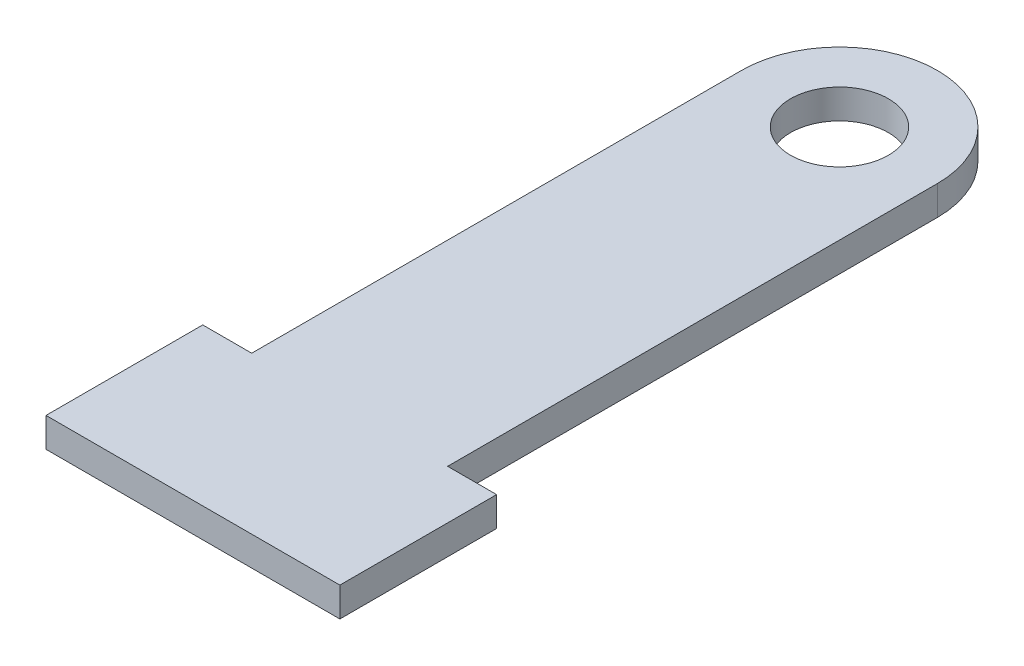
ISO-10303-21;
HEADER;
FILE_DESCRIPTION(('STEP AP214'),'2;1');
FILE_NAME('part.step','',(''),(''),'','','');
FILE_SCHEMA(('AUTOMOTIVE_DESIGN { 1 0 10303 214 1 1 1 1 }'));
ENDSEC;
DATA;
#1=APPLICATION_CONTEXT('core data for automotive mechanical design processes');
#2=APPLICATION_PROTOCOL_DEFINITION('international standard','automotive_design',2000,#1);
#3=PRODUCT_CONTEXT('',#1,'mechanical');
#4=PRODUCT('Part','Part','',(#3));
#5=PRODUCT_RELATED_PRODUCT_CATEGORY('part','',(#4));
#6=PRODUCT_DEFINITION_FORMATION('','',#4);
#7=PRODUCT_DEFINITION_CONTEXT('part definition',#1,'design');
#8=PRODUCT_DEFINITION('design','',#6,#7);
#9=PRODUCT_DEFINITION_SHAPE('','',#8);
#10=(LENGTH_UNIT() NAMED_UNIT(*) SI_UNIT(.MILLI.,.METRE.));
#11=(NAMED_UNIT(*) PLANE_ANGLE_UNIT() SI_UNIT($,.RADIAN.));
#12=(NAMED_UNIT(*) SI_UNIT($,.STERADIAN.) SOLID_ANGLE_UNIT());
#13=UNCERTAINTY_MEASURE_WITH_UNIT(LENGTH_MEASURE(1.E-05),#10,'distance_accuracy_value','');
#14=(GEOMETRIC_REPRESENTATION_CONTEXT(3) GLOBAL_UNCERTAINTY_ASSIGNED_CONTEXT((#13)) GLOBAL_UNIT_ASSIGNED_CONTEXT((#10,
#11,#12)) REPRESENTATION_CONTEXT('',''));
#15=CARTESIAN_POINT('',(0.,0.,0.));
#16=DIRECTION('',(0.,0.,1.));
#17=DIRECTION('',(1.,0.,0.));
#18=AXIS2_PLACEMENT_3D('',#15,#16,#17);
#19=CARTESIAN_POINT('',(-1.5,-0.3,0.));
#20=DIRECTION('',(0.,0.,-1.));
#21=DIRECTION('',(-1.,0.,0.));
#22=AXIS2_PLACEMENT_3D('',#19,#20,#21);
#23=PLANE('',#22);
#24=DIRECTION('',(-1.,0.,0.));
#25=VECTOR('',#24,1.);
#26=CARTESIAN_POINT('',(-1.5,0.,0.));
#27=LINE('',#26,#25);
#28=CARTESIAN_POINT('',(-1.,0.,0.));
#29=VERTEX_POINT('',#28);
#30=CARTESIAN_POINT('',(-1.5,0.,0.));
#31=VERTEX_POINT('',#30);
#32=EDGE_CURVE('E135',#29,#31,#27,.T.);
#33=ORIENTED_EDGE('',*,*,#32,.F.);
#34=DIRECTION('',(0.,1.,0.));
#35=VECTOR('',#34,1.);
#36=CARTESIAN_POINT('',(-1.,-0.3,0.));
#37=LINE('',#36,#35);
#38=CARTESIAN_POINT('',(-1.,-0.3,0.));
#39=VERTEX_POINT('',#38);
#40=EDGE_CURVE('E11',#39,#29,#37,.T.);
#41=ORIENTED_EDGE('',*,*,#40,.F.);
#42=DIRECTION('',(-1.,0.,0.));
#43=VECTOR('',#42,1.);
#44=CARTESIAN_POINT('',(-1.5,-0.3,0.));
#45=LINE('',#44,#43);
#46=CARTESIAN_POINT('',(-1.5,-0.3,0.));
#47=VERTEX_POINT('',#46);
#48=EDGE_CURVE('E156',#39,#47,#45,.T.);
#49=ORIENTED_EDGE('',*,*,#48,.T.);
#50=DIRECTION('',(0.,1.,0.));
#51=VECTOR('',#50,1.);
#52=CARTESIAN_POINT('',(-1.5,-0.3,0.));
#53=LINE('',#52,#51);
#54=EDGE_CURVE('E41',#47,#31,#53,.T.);
#55=ORIENTED_EDGE('',*,*,#54,.T.);
#56=EDGE_LOOP('',(#33,#41,#49,#55));
#57=FACE_BOUND('',#56,.T.);
#58=ADVANCED_FACE('F38',(#57),#23,.T.);
#59=CARTESIAN_POINT('',(-1.,-0.3,0.));
#60=DIRECTION('',(-1.,0.,0.));
#61=DIRECTION('',(0.,0.,1.));
#62=AXIS2_PLACEMENT_3D('',#59,#60,#61);
#63=PLANE('',#62);
#64=DIRECTION('',(0.,0.,1.));
#65=VECTOR('',#64,1.);
#66=CARTESIAN_POINT('',(-1.,0.,0.));
#67=LINE('',#66,#65);
#68=CARTESIAN_POINT('',(-1.,0.,-5.));
#69=VERTEX_POINT('',#68);
#70=EDGE_CURVE('E154',#69,#29,#67,.T.);
#71=ORIENTED_EDGE('',*,*,#70,.F.);
#72=DIRECTION('',(0.,1.,0.));
#73=VECTOR('',#72,1.);
#74=CARTESIAN_POINT('',(-1.,-0.3,-5.));
#75=LINE('',#74,#73);
#76=CARTESIAN_POINT('',(-1.,-0.3,-5.));
#77=VERTEX_POINT('',#76);
#78=EDGE_CURVE('E47',#77,#69,#75,.T.);
#79=ORIENTED_EDGE('',*,*,#78,.F.);
#80=DIRECTION('',(0.,0.,1.));
#81=VECTOR('',#80,1.);
#82=CARTESIAN_POINT('',(-1.,-0.3,0.));
#83=LINE('',#82,#81);
#84=EDGE_CURVE('E125',#77,#39,#83,.T.);
#85=ORIENTED_EDGE('',*,*,#84,.T.);
#86=ORIENTED_EDGE('',*,*,#40,.T.);
#87=EDGE_LOOP('',(#71,#79,#85,#86));
#88=FACE_BOUND('',#87,.T.);
#89=ADVANCED_FACE('F168',(#88),#63,.T.);
#90=CARTESIAN_POINT('',(0.,-0.3,-5.));
#91=DIRECTION('',(0.,1.,0.));
#92=DIRECTION('',(0.,0.,1.));
#93=AXIS2_PLACEMENT_3D('',#90,#91,#92);
#94=CYLINDRICAL_SURFACE('',#93,1.);
#95=CARTESIAN_POINT('',(0.,0.,-5.));
#96=DIRECTION('',(0.,1.,0.));
#97=DIRECTION('',(0.,0.,1.));
#98=AXIS2_PLACEMENT_3D('',#95,#96,#97);
#99=CIRCLE('',#98,1.);
#100=CARTESIAN_POINT('',(1.,0.,-5.));
#101=VERTEX_POINT('',#100);
#102=EDGE_CURVE('E112',#101,#69,#99,.T.);
#103=ORIENTED_EDGE('',*,*,#102,.F.);
#104=DIRECTION('',(0.,1.,0.));
#105=VECTOR('',#104,1.);
#106=CARTESIAN_POINT('',(1.,-0.3,-5.));
#107=LINE('',#106,#105);
#108=CARTESIAN_POINT('',(1.,-0.3,-5.));
#109=VERTEX_POINT('',#108);
#110=EDGE_CURVE('E107',#109,#101,#107,.T.);
#111=ORIENTED_EDGE('',*,*,#110,.F.);
#112=CARTESIAN_POINT('',(0.,-0.3,-5.));
#113=DIRECTION('',(0.,1.,0.));
#114=DIRECTION('',(0.,0.,1.));
#115=AXIS2_PLACEMENT_3D('',#112,#113,#114);
#116=CIRCLE('',#115,1.);
#117=EDGE_CURVE('E110',#109,#77,#116,.T.);
#118=ORIENTED_EDGE('',*,*,#117,.T.);
#119=ORIENTED_EDGE('',*,*,#78,.T.);
#120=EDGE_LOOP('',(#103,#111,#118,#119));
#121=FACE_BOUND('',#120,.T.);
#122=ADVANCED_FACE('F109',(#121),#94,.T.);
#123=CARTESIAN_POINT('',(1.,-0.3,0.));
#124=DIRECTION('',(1.,0.,0.));
#125=DIRECTION('',(0.,0.,-1.));
#126=AXIS2_PLACEMENT_3D('',#123,#124,#125);
#127=PLANE('',#126);
#128=DIRECTION('',(0.,0.,-1.));
#129=VECTOR('',#128,1.);
#130=CARTESIAN_POINT('',(1.,0.,0.));
#131=LINE('',#130,#129);
#132=CARTESIAN_POINT('',(1.,0.,0.));
#133=VERTEX_POINT('',#132);
#134=EDGE_CURVE('E151',#133,#101,#131,.T.);
#135=ORIENTED_EDGE('',*,*,#134,.F.);
#136=DIRECTION('',(0.,1.,0.));
#137=VECTOR('',#136,1.);
#138=CARTESIAN_POINT('',(1.,-0.3,0.));
#139=LINE('',#138,#137);
#140=CARTESIAN_POINT('',(1.,-0.3,0.));
#141=VERTEX_POINT('',#140);
#142=EDGE_CURVE('E117',#141,#133,#139,.T.);
#143=ORIENTED_EDGE('',*,*,#142,.F.);
#144=DIRECTION('',(0.,0.,-1.));
#145=VECTOR('',#144,1.);
#146=CARTESIAN_POINT('',(1.,-0.3,0.));
#147=LINE('',#146,#145);
#148=EDGE_CURVE('E123',#141,#109,#147,.T.);
#149=ORIENTED_EDGE('',*,*,#148,.T.);
#150=ORIENTED_EDGE('',*,*,#110,.T.);
#151=EDGE_LOOP('',(#135,#143,#149,#150));
#152=FACE_BOUND('',#151,.T.);
#153=ADVANCED_FACE('F127',(#152),#127,.T.);
#154=CARTESIAN_POINT('',(1.,-0.3,0.));
#155=DIRECTION('',(0.,0.,-1.));
#156=DIRECTION('',(-1.,0.,0.));
#157=AXIS2_PLACEMENT_3D('',#154,#155,#156);
#158=PLANE('',#157);
#159=DIRECTION('',(-1.,0.,0.));
#160=VECTOR('',#159,1.);
#161=CARTESIAN_POINT('',(1.,0.,0.));
#162=LINE('',#161,#160);
#163=CARTESIAN_POINT('',(1.5,0.,0.));
#164=VERTEX_POINT('',#163);
#165=EDGE_CURVE('E148',#164,#133,#162,.T.);
#166=ORIENTED_EDGE('',*,*,#165,.F.);
#167=DIRECTION('',(0.,1.,0.));
#168=VECTOR('',#167,1.);
#169=CARTESIAN_POINT('',(1.5,-0.3,0.));
#170=LINE('',#169,#168);
#171=CARTESIAN_POINT('',(1.5,-0.3,0.));
#172=VERTEX_POINT('',#171);
#173=EDGE_CURVE('E160',#172,#164,#170,.T.);
#174=ORIENTED_EDGE('',*,*,#173,.F.);
#175=DIRECTION('',(-1.,0.,0.));
#176=VECTOR('',#175,1.);
#177=CARTESIAN_POINT('',(1.,-0.3,0.));
#178=LINE('',#177,#176);
#179=EDGE_CURVE('E128',#172,#141,#178,.T.);
#180=ORIENTED_EDGE('',*,*,#179,.T.);
#181=ORIENTED_EDGE('',*,*,#142,.T.);
#182=EDGE_LOOP('',(#166,#174,#180,#181));
#183=FACE_BOUND('',#182,.T.);
#184=ADVANCED_FACE('F181',(#183),#158,.T.);
#185=CARTESIAN_POINT('',(1.5,-0.3,0.));
#186=DIRECTION('',(1.,0.,0.));
#187=DIRECTION('',(0.,0.,-1.));
#188=AXIS2_PLACEMENT_3D('',#185,#186,#187);
#189=PLANE('',#188);
#190=DIRECTION('',(0.,0.,-1.));
#191=VECTOR('',#190,1.);
#192=CARTESIAN_POINT('',(1.5,0.,0.));
#193=LINE('',#192,#191);
#194=CARTESIAN_POINT('',(1.5,0.,1.6));
#195=VERTEX_POINT('',#194);
#196=EDGE_CURVE('E145',#195,#164,#193,.T.);
#197=ORIENTED_EDGE('',*,*,#196,.F.);
#198=DIRECTION('',(0.,1.,0.));
#199=VECTOR('',#198,1.);
#200=CARTESIAN_POINT('',(1.5,-0.3,1.6));
#201=LINE('',#200,#199);
#202=CARTESIAN_POINT('',(1.5,-0.3,1.6));
#203=VERTEX_POINT('',#202);
#204=EDGE_CURVE('E162',#203,#195,#201,.T.);
#205=ORIENTED_EDGE('',*,*,#204,.F.);
#206=DIRECTION('',(0.,0.,-1.));
#207=VECTOR('',#206,1.);
#208=CARTESIAN_POINT('',(1.5,-0.3,0.));
#209=LINE('',#208,#207);
#210=EDGE_CURVE('E130',#203,#172,#209,.T.);
#211=ORIENTED_EDGE('',*,*,#210,.T.);
#212=ORIENTED_EDGE('',*,*,#173,.T.);
#213=EDGE_LOOP('',(#197,#205,#211,#212));
#214=FACE_BOUND('',#213,.T.);
#215=ADVANCED_FACE('F184',(#214),#189,.T.);
#216=CARTESIAN_POINT('',(-1.5,-0.3,1.6));
#217=DIRECTION('',(0.,0.,1.));
#218=DIRECTION('',(1.,0.,0.));
#219=AXIS2_PLACEMENT_3D('',#216,#217,#218);
#220=PLANE('',#219);
#221=DIRECTION('',(1.,0.,0.));
#222=VECTOR('',#221,1.);
#223=CARTESIAN_POINT('',(-1.5,0.,1.6));
#224=LINE('',#223,#222);
#225=CARTESIAN_POINT('',(-1.5,0.,1.6));
#226=VERTEX_POINT('',#225);
#227=EDGE_CURVE('E142',#226,#195,#224,.T.);
#228=ORIENTED_EDGE('',*,*,#227,.F.);
#229=DIRECTION('',(0.,1.,0.));
#230=VECTOR('',#229,1.);
#231=CARTESIAN_POINT('',(-1.5,-0.3,1.6));
#232=LINE('',#231,#230);
#233=CARTESIAN_POINT('',(-1.5,-0.3,1.6));
#234=VERTEX_POINT('',#233);
#235=EDGE_CURVE('E163',#234,#226,#232,.T.);
#236=ORIENTED_EDGE('',*,*,#235,.F.);
#237=DIRECTION('',(1.,0.,0.));
#238=VECTOR('',#237,1.);
#239=CARTESIAN_POINT('',(-1.5,-0.3,1.6));
#240=LINE('',#239,#238);
#241=EDGE_CURVE('E219',#234,#203,#240,.T.);
#242=ORIENTED_EDGE('',*,*,#241,.T.);
#243=ORIENTED_EDGE('',*,*,#204,.T.);
#244=EDGE_LOOP('',(#228,#236,#242,#243));
#245=FACE_BOUND('',#244,.T.);
#246=ADVANCED_FACE('F188',(#245),#220,.T.);
#247=CARTESIAN_POINT('',(-1.5,-0.3,0.));
#248=DIRECTION('',(-1.,0.,0.));
#249=DIRECTION('',(0.,0.,1.));
#250=AXIS2_PLACEMENT_3D('',#247,#248,#249);
#251=PLANE('',#250);
#252=DIRECTION('',(0.,0.,1.));
#253=VECTOR('',#252,1.);
#254=CARTESIAN_POINT('',(-1.5,0.,0.));
#255=LINE('',#254,#253);
#256=EDGE_CURVE('E138',#31,#226,#255,.T.);
#257=ORIENTED_EDGE('',*,*,#256,.F.);
#258=ORIENTED_EDGE('',*,*,#54,.F.);
#259=DIRECTION('',(0.,0.,1.));
#260=VECTOR('',#259,1.);
#261=CARTESIAN_POINT('',(-1.5,-0.3,0.));
#262=LINE('',#261,#260);
#263=EDGE_CURVE('E217',#47,#234,#262,.T.);
#264=ORIENTED_EDGE('',*,*,#263,.T.);
#265=ORIENTED_EDGE('',*,*,#235,.T.);
#266=EDGE_LOOP('',(#257,#258,#264,#265));
#267=FACE_BOUND('',#266,.T.);
#268=ADVANCED_FACE('F165',(#267),#251,.T.);
#269=CARTESIAN_POINT('',(0.,-0.3,-5.));
#270=DIRECTION('',(0.,1.,0.));
#271=DIRECTION('',(0.,0.,1.));
#272=AXIS2_PLACEMENT_3D('',#269,#270,#271);
#273=PLANE('',#272);
#274=CARTESIAN_POINT('',(0.,-0.3,-5.));
#275=DIRECTION('',(0.,1.,0.));
#276=DIRECTION('',(0.,0.,1.));
#277=AXIS2_PLACEMENT_3D('',#274,#275,#276);
#278=CIRCLE('',#277,0.5);
#279=CARTESIAN_POINT('',(0.,-0.3,-4.5));
#280=VERTEX_POINT('',#279);
#281=EDGE_CURVE('E139',#280,#280,#278,.T.);
#282=ORIENTED_EDGE('',*,*,#281,.T.);
#283=EDGE_LOOP('',(#282));
#284=FACE_BOUND('',#283,.T.);
#285=ORIENTED_EDGE('',*,*,#48,.F.);
#286=ORIENTED_EDGE('',*,*,#84,.F.);
#287=ORIENTED_EDGE('',*,*,#117,.F.);
#288=ORIENTED_EDGE('',*,*,#148,.F.);
#289=ORIENTED_EDGE('',*,*,#179,.F.);
#290=ORIENTED_EDGE('',*,*,#210,.F.);
#291=ORIENTED_EDGE('',*,*,#241,.F.);
#292=ORIENTED_EDGE('',*,*,#263,.F.);
#293=EDGE_LOOP('',(#285,#286,#287,#288,#289,#290,#291,#292));
#294=FACE_BOUND('',#293,.T.);
#295=ADVANCED_FACE('F121',(#284,#294),#273,.F.);
#296=CARTESIAN_POINT('',(0.,0.,-5.));
#297=DIRECTION('',(0.,1.,0.));
#298=DIRECTION('',(0.,0.,1.));
#299=AXIS2_PLACEMENT_3D('',#296,#297,#298);
#300=PLANE('',#299);
#301=CARTESIAN_POINT('',(0.,0.,-5.));
#302=DIRECTION('',(0.,1.,0.));
#303=DIRECTION('',(0.,0.,1.));
#304=AXIS2_PLACEMENT_3D('',#301,#302,#303);
#305=CIRCLE('',#304,0.5);
#306=CARTESIAN_POINT('',(0.,0.,-4.5));
#307=VERTEX_POINT('',#306);
#308=EDGE_CURVE('E212',#307,#307,#305,.T.);
#309=ORIENTED_EDGE('',*,*,#308,.F.);
#310=EDGE_LOOP('',(#309));
#311=FACE_BOUND('',#310,.T.);
#312=ORIENTED_EDGE('',*,*,#32,.T.);
#313=ORIENTED_EDGE('',*,*,#256,.T.);
#314=ORIENTED_EDGE('',*,*,#227,.T.);
#315=ORIENTED_EDGE('',*,*,#196,.T.);
#316=ORIENTED_EDGE('',*,*,#165,.T.);
#317=ORIENTED_EDGE('',*,*,#134,.T.);
#318=ORIENTED_EDGE('',*,*,#102,.T.);
#319=ORIENTED_EDGE('',*,*,#70,.T.);
#320=EDGE_LOOP('',(#312,#313,#314,#315,#316,#317,#318,#319));
#321=FACE_BOUND('',#320,.T.);
#322=ADVANCED_FACE('F167',(#311,#321),#300,.T.);
#323=CARTESIAN_POINT('',(0.,-0.3,-5.));
#324=DIRECTION('',(0.,1.,0.));
#325=DIRECTION('',(0.,0.,1.));
#326=AXIS2_PLACEMENT_3D('',#323,#324,#325);
#327=CYLINDRICAL_SURFACE('',#326,0.5);
#328=ORIENTED_EDGE('',*,*,#281,.F.);
#329=EDGE_LOOP('',(#328));
#330=FACE_BOUND('',#329,.T.);
#331=ORIENTED_EDGE('',*,*,#308,.T.);
#332=EDGE_LOOP('',(#331));
#333=FACE_BOUND('',#332,.T.);
#334=ADVANCED_FACE('F200',(#330,#333),#327,.F.);
#335=CLOSED_SHELL('',(#58,#89,#122,#153,#184,#215,#246,#268,#295,#322,#334));
#336=MANIFOLD_SOLID_BREP('B2',#335);
#337=ADVANCED_BREP_SHAPE_REPRESENTATION('',(#18,#336),#14);
#338=SHAPE_DEFINITION_REPRESENTATION(#9,#337);
ENDSEC;
END-ISO-10303-21;
